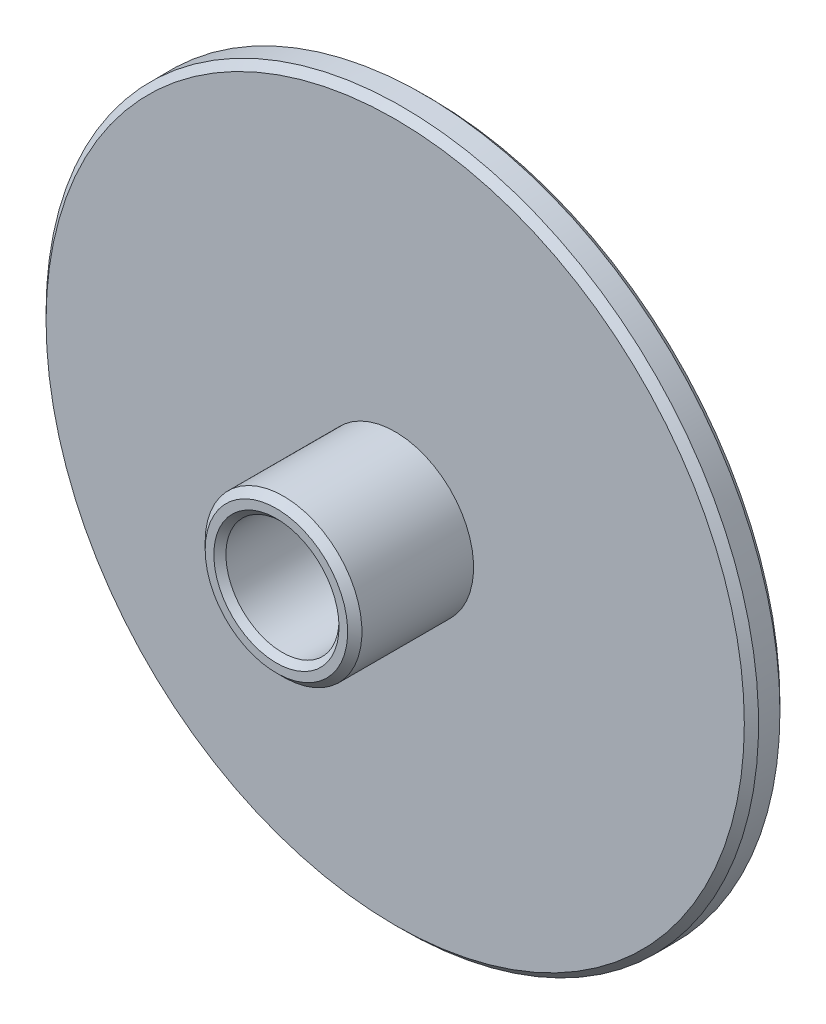
ISO-10303-21;
HEADER;
FILE_DESCRIPTION(('STEP AP214'),'2;1');
FILE_NAME('part.step','',(''),(''),'','','');
FILE_SCHEMA(('AUTOMOTIVE_DESIGN { 1 0 10303 214 1 1 1 1 }'));
ENDSEC;
DATA;
#1=APPLICATION_CONTEXT('core data for automotive mechanical design processes');
#2=APPLICATION_PROTOCOL_DEFINITION('international standard','automotive_design',2000,#1);
#3=PRODUCT_CONTEXT('',#1,'mechanical');
#4=PRODUCT('Part','Part','',(#3));
#5=PRODUCT_RELATED_PRODUCT_CATEGORY('part','',(#4));
#6=PRODUCT_DEFINITION_FORMATION('','',#4);
#7=PRODUCT_DEFINITION_CONTEXT('part definition',#1,'design');
#8=PRODUCT_DEFINITION('design','',#6,#7);
#9=PRODUCT_DEFINITION_SHAPE('','',#8);
#10=(LENGTH_UNIT() NAMED_UNIT(*) SI_UNIT(.MILLI.,.METRE.));
#11=(NAMED_UNIT(*) PLANE_ANGLE_UNIT() SI_UNIT($,.RADIAN.));
#12=(NAMED_UNIT(*) SI_UNIT($,.STERADIAN.) SOLID_ANGLE_UNIT());
#13=UNCERTAINTY_MEASURE_WITH_UNIT(LENGTH_MEASURE(1.E-05),#10,'distance_accuracy_value','');
#14=(GEOMETRIC_REPRESENTATION_CONTEXT(3) GLOBAL_UNCERTAINTY_ASSIGNED_CONTEXT((#13)) GLOBAL_UNIT_ASSIGNED_CONTEXT((#10,
#11,#12)) REPRESENTATION_CONTEXT('',''));
#15=CARTESIAN_POINT('',(0.,0.,0.));
#16=DIRECTION('',(0.,0.,1.));
#17=DIRECTION('',(1.,0.,0.));
#18=AXIS2_PLACEMENT_3D('',#15,#16,#17);
#19=CARTESIAN_POINT('',(0.,0.,6.5));
#20=DIRECTION('',(0.,0.,1.));
#21=DIRECTION('',(1.,0.,0.));
#22=AXIS2_PLACEMENT_3D('',#19,#20,#21);
#23=PLANE('',#22);
#24=CARTESIAN_POINT('',(0.,0.,6.5));
#25=DIRECTION('',(0.,0.,1.));
#26=DIRECTION('',(1.,0.,0.));
#27=AXIS2_PLACEMENT_3D('',#24,#25,#26);
#28=CIRCLE('',#27,2.63524999999999);
#29=CARTESIAN_POINT('',(2.63524999999999,0.,6.5));
#30=VERTEX_POINT('',#29);
#31=EDGE_CURVE('E11',#30,#30,#28,.F.);
#32=ORIENTED_EDGE('',*,*,#31,.T.);
#33=EDGE_LOOP('',(#32));
#34=FACE_BOUND('',#33,.T.);
#35=CARTESIAN_POINT('',(0.,0.,6.49999999995998));
#36=DIRECTION('',(0.,0.,-1.));
#37=DIRECTION('',(-1.,0.,0.));
#38=AXIS2_PLACEMENT_3D('',#35,#36,#37);
#39=CIRCLE('',#38,2.9999999999859);
#40=CARTESIAN_POINT('',(-2.9999999999859,0.,6.49999999995998));
#41=VERTEX_POINT('',#40);
#42=EDGE_CURVE('E57',#41,#41,#39,.T.);
#43=ORIENTED_EDGE('',*,*,#42,.F.);
#44=EDGE_LOOP('',(#43));
#45=FACE_BOUND('',#44,.T.);
#46=ADVANCED_FACE('F37',(#34,#45),#23,.T.);
#47=CARTESIAN_POINT('',(0.,0.,6.19999999997844));
#48=DIRECTION('',(0.,0.,-1.));
#49=DIRECTION('',(-1.,0.,0.));
#50=AXIS2_PLACEMENT_3D('',#47,#48,#49);
#51=CONICAL_SURFACE('',#50,3.29999999996744,0.785398163397448);
#52=CARTESIAN_POINT('',(0.,0.,6.2));
#53=DIRECTION('',(0.,0.,-1.));
#54=DIRECTION('',(-1.,0.,0.));
#55=AXIS2_PLACEMENT_3D('',#52,#53,#54);
#56=CIRCLE('',#55,3.3);
#57=CARTESIAN_POINT('',(-3.3,0.,6.2));
#58=VERTEX_POINT('',#57);
#59=EDGE_CURVE('E60',#58,#58,#56,.T.);
#60=ORIENTED_EDGE('',*,*,#59,.F.);
#61=EDGE_LOOP('',(#60));
#62=FACE_BOUND('',#61,.T.);
#63=ORIENTED_EDGE('',*,*,#42,.T.);
#64=EDGE_LOOP('',(#63));
#65=FACE_BOUND('',#64,.T.);
#66=ADVANCED_FACE('F116',(#62,#65),#51,.T.);
#67=CARTESIAN_POINT('',(0.,0.,6.5));
#68=DIRECTION('',(0.,0.,-1.));
#69=DIRECTION('',(-1.,0.,0.));
#70=AXIS2_PLACEMENT_3D('',#67,#68,#69);
#71=CYLINDRICAL_SURFACE('',#70,3.3);
#72=CARTESIAN_POINT('',(0.,0.,1.5));
#73=DIRECTION('',(0.,0.,-1.));
#74=DIRECTION('',(-1.,0.,0.));
#75=AXIS2_PLACEMENT_3D('',#72,#73,#74);
#76=CIRCLE('',#75,3.3);
#77=CARTESIAN_POINT('',(-3.3,0.,1.5));
#78=VERTEX_POINT('',#77);
#79=EDGE_CURVE('E73',#78,#78,#76,.T.);
#80=ORIENTED_EDGE('',*,*,#79,.F.);
#81=EDGE_LOOP('',(#80));
#82=FACE_BOUND('',#81,.T.);
#83=ORIENTED_EDGE('',*,*,#59,.T.);
#84=EDGE_LOOP('',(#83));
#85=FACE_BOUND('',#84,.T.);
#86=ADVANCED_FACE('F112',(#82,#85),#71,.T.);
#87=CARTESIAN_POINT('',(0.,0.,1.5));
#88=DIRECTION('',(0.,0.,1.));
#89=DIRECTION('',(1.,0.,0.));
#90=AXIS2_PLACEMENT_3D('',#87,#88,#89);
#91=PLANE('',#90);
#92=ORIENTED_EDGE('',*,*,#79,.T.);
#93=EDGE_LOOP('',(#92));
#94=FACE_BOUND('',#93,.T.);
#95=CARTESIAN_POINT('',(0.,0.,1.5));
#96=DIRECTION('',(0.,0.,-1.));
#97=DIRECTION('',(-1.,0.,0.));
#98=AXIS2_PLACEMENT_3D('',#95,#96,#97);
#99=CIRCLE('',#98,14.7);
#100=CARTESIAN_POINT('',(-14.7,0.,1.5));
#101=VERTEX_POINT('',#100);
#102=EDGE_CURVE('E70',#101,#101,#99,.T.);
#103=ORIENTED_EDGE('',*,*,#102,.F.);
#104=EDGE_LOOP('',(#103));
#105=FACE_BOUND('',#104,.T.);
#106=ADVANCED_FACE('F108',(#94,#105),#91,.T.);
#107=CARTESIAN_POINT('',(0.,0.,1.19999999999998));
#108=DIRECTION('',(0.,0.,-1.));
#109=DIRECTION('',(-1.,0.,0.));
#110=AXIS2_PLACEMENT_3D('',#107,#108,#109);
#111=CONICAL_SURFACE('',#110,15.,0.78539816339745);
#112=ORIENTED_EDGE('',*,*,#102,.T.);
#113=EDGE_LOOP('',(#112));
#114=FACE_BOUND('',#113,.T.);
#115=CARTESIAN_POINT('',(0.,0.,1.19999999999998));
#116=DIRECTION('',(0.,0.,-1.));
#117=DIRECTION('',(-1.,0.,0.));
#118=AXIS2_PLACEMENT_3D('',#115,#116,#117);
#119=CIRCLE('',#118,15.);
#120=CARTESIAN_POINT('',(-15.,0.,1.19999999999998));
#121=VERTEX_POINT('',#120);
#122=EDGE_CURVE('E67',#121,#121,#119,.T.);
#123=ORIENTED_EDGE('',*,*,#122,.F.);
#124=EDGE_LOOP('',(#123));
#125=FACE_BOUND('',#124,.T.);
#126=ADVANCED_FACE('F104',(#114,#125),#111,.T.);
#127=CARTESIAN_POINT('',(0.,0.,1.5));
#128=DIRECTION('',(0.,0.,-1.));
#129=DIRECTION('',(-1.,0.,0.));
#130=AXIS2_PLACEMENT_3D('',#127,#128,#129);
#131=CYLINDRICAL_SURFACE('',#130,15.);
#132=ORIENTED_EDGE('',*,*,#122,.T.);
#133=EDGE_LOOP('',(#132));
#134=FACE_BOUND('',#133,.T.);
#135=CARTESIAN_POINT('',(0.,0.,0.299999999999989));
#136=DIRECTION('',(0.,0.,1.));
#137=DIRECTION('',(1.,0.,0.));
#138=AXIS2_PLACEMENT_3D('',#135,#136,#137);
#139=CIRCLE('',#138,15.);
#140=CARTESIAN_POINT('',(15.,0.,0.29999999999999));
#141=VERTEX_POINT('',#140);
#142=EDGE_CURVE('E63',#141,#141,#139,.F.);
#143=ORIENTED_EDGE('',*,*,#142,.F.);
#144=EDGE_LOOP('',(#143));
#145=FACE_BOUND('',#144,.T.);
#146=ADVANCED_FACE('F97',(#134,#145),#131,.T.);
#147=CARTESIAN_POINT('',(0.,0.,0.29999999999999));
#148=DIRECTION('',(0.,0.,1.));
#149=DIRECTION('',(1.,0.,0.));
#150=AXIS2_PLACEMENT_3D('',#147,#148,#149);
#151=CONICAL_SURFACE('',#150,15.,0.785398163397454);
#152=CARTESIAN_POINT('',(0.,0.,0.));
#153=DIRECTION('',(0.,0.,1.));
#154=DIRECTION('',(1.,0.,0.));
#155=AXIS2_PLACEMENT_3D('',#152,#153,#154);
#156=CIRCLE('',#155,14.7);
#157=CARTESIAN_POINT('',(14.7,0.,0.));
#158=VERTEX_POINT('',#157);
#159=EDGE_CURVE('E66',#158,#158,#156,.T.);
#160=ORIENTED_EDGE('',*,*,#159,.T.);
#161=EDGE_LOOP('',(#160));
#162=FACE_BOUND('',#161,.T.);
#163=ORIENTED_EDGE('',*,*,#142,.T.);
#164=EDGE_LOOP('',(#163));
#165=FACE_BOUND('',#164,.T.);
#166=ADVANCED_FACE('F91',(#162,#165),#151,.T.);
#167=CARTESIAN_POINT('',(0.,0.,0.));
#168=DIRECTION('',(0.,0.,1.));
#169=DIRECTION('',(1.,0.,0.));
#170=AXIS2_PLACEMENT_3D('',#167,#168,#169);
#171=PLANE('',#170);
#172=ORIENTED_EDGE('',*,*,#159,.F.);
#173=EDGE_LOOP('',(#172));
#174=FACE_BOUND('',#173,.T.);
#175=ADVANCED_FACE('F51',(#174),#171,.F.);
#176=CARTESIAN_POINT('',(0.,0.,1.4962));
#177=DIRECTION('',(0.,0.,1.));
#178=DIRECTION('',(1.,0.,0.));
#179=AXIS2_PLACEMENT_3D('',#176,#177,#178);
#180=CONICAL_SURFACE('',#179,2.38125,1.02974425867665);
#181=CARTESIAN_POINT('',(0.,0.,0.0654006509406228));
#182=VERTEX_POINT('',#181);
#183=VERTEX_LOOP('',#182);
#184=FACE_BOUND('',#183,.T.);
#185=CARTESIAN_POINT('',(0.,0.,1.4962));
#186=DIRECTION('',(0.,0.,1.));
#187=DIRECTION('',(1.,0.,0.));
#188=AXIS2_PLACEMENT_3D('',#185,#186,#187);
#189=CIRCLE('',#188,2.38125);
#190=CARTESIAN_POINT('',(2.38125,0.,1.4962));
#191=VERTEX_POINT('',#190);
#192=EDGE_CURVE('E55',#191,#191,#189,.T.);
#193=ORIENTED_EDGE('',*,*,#192,.T.);
#194=EDGE_LOOP('',(#193));
#195=FACE_BOUND('',#194,.T.);
#196=ADVANCED_FACE('F47',(#184,#195),#180,.F.);
#197=CARTESIAN_POINT('',(0.,0.,6.5));
#198=DIRECTION('',(0.,0.,1.));
#199=DIRECTION('',(1.,0.,0.));
#200=AXIS2_PLACEMENT_3D('',#197,#198,#199);
#201=CYLINDRICAL_SURFACE('',#200,2.38125);
#202=CARTESIAN_POINT('',(0.,0.,6.24600000000001));
#203=DIRECTION('',(0.,0.,1.));
#204=DIRECTION('',(1.,0.,0.));
#205=AXIS2_PLACEMENT_3D('',#202,#203,#204);
#206=CIRCLE('',#205,2.38125);
#207=CARTESIAN_POINT('',(2.38125,0.,6.24600000000001));
#208=VERTEX_POINT('',#207);
#209=EDGE_CURVE('E44',#208,#208,#206,.T.);
#210=ORIENTED_EDGE('',*,*,#209,.T.);
#211=EDGE_LOOP('',(#210));
#212=FACE_BOUND('',#211,.T.);
#213=ORIENTED_EDGE('',*,*,#192,.F.);
#214=EDGE_LOOP('',(#213));
#215=FACE_BOUND('',#214,.T.);
#216=ADVANCED_FACE('F50',(#212,#215),#201,.F.);
#217=CARTESIAN_POINT('',(0.,0.,6.24600000000001));
#218=DIRECTION('',(0.,0.,1.));
#219=DIRECTION('',(1.,0.,0.));
#220=AXIS2_PLACEMENT_3D('',#217,#218,#219);
#221=CONICAL_SURFACE('',#220,2.38125,0.785398163397447);
#222=ORIENTED_EDGE('',*,*,#31,.F.);
#223=EDGE_LOOP('',(#222));
#224=FACE_BOUND('',#223,.T.);
#225=ORIENTED_EDGE('',*,*,#209,.F.);
#226=EDGE_LOOP('',(#225));
#227=FACE_BOUND('',#226,.T.);
#228=ADVANCED_FACE('F39',(#224,#227),#221,.F.);
#229=CLOSED_SHELL('',(#46,#66,#86,#106,#126,#146,#166,#175,#196,#216,#228));
#230=MANIFOLD_SOLID_BREP('B2',#229);
#231=ADVANCED_BREP_SHAPE_REPRESENTATION('',(#18,#230),#14);
#232=SHAPE_DEFINITION_REPRESENTATION(#9,#231);
ENDSEC;
END-ISO-10303-21;
